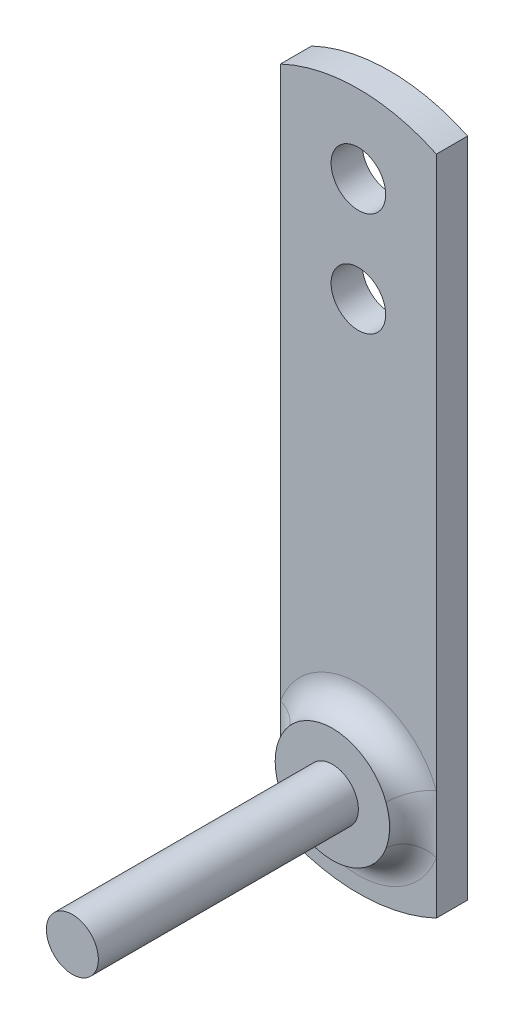
ISO-10303-21;
HEADER;
FILE_DESCRIPTION(('STEP AP214'),'2;1');
FILE_NAME('part.step','',(''),(''),'','','');
FILE_SCHEMA(('AUTOMOTIVE_DESIGN { 1 0 10303 214 1 1 1 1 }'));
ENDSEC;
DATA;
#1=APPLICATION_CONTEXT('core data for automotive mechanical design processes');
#2=APPLICATION_PROTOCOL_DEFINITION('international standard','automotive_design',2000,#1);
#3=PRODUCT_CONTEXT('',#1,'mechanical');
#4=PRODUCT('Part','Part','',(#3));
#5=PRODUCT_RELATED_PRODUCT_CATEGORY('part','',(#4));
#6=PRODUCT_DEFINITION_FORMATION('','',#4);
#7=PRODUCT_DEFINITION_CONTEXT('part definition',#1,'design');
#8=PRODUCT_DEFINITION('design','',#6,#7);
#9=PRODUCT_DEFINITION_SHAPE('','',#8);
#10=(LENGTH_UNIT() NAMED_UNIT(*) SI_UNIT(.MILLI.,.METRE.));
#11=(NAMED_UNIT(*) PLANE_ANGLE_UNIT() SI_UNIT($,.RADIAN.));
#12=(NAMED_UNIT(*) SI_UNIT($,.STERADIAN.) SOLID_ANGLE_UNIT());
#13=UNCERTAINTY_MEASURE_WITH_UNIT(LENGTH_MEASURE(1.E-05),#10,'distance_accuracy_value','');
#14=(GEOMETRIC_REPRESENTATION_CONTEXT(3) GLOBAL_UNCERTAINTY_ASSIGNED_CONTEXT((#13)) GLOBAL_UNIT_ASSIGNED_CONTEXT((#10,
#11,#12)) REPRESENTATION_CONTEXT('',''));
#15=CARTESIAN_POINT('',(0.,0.,0.));
#16=DIRECTION('',(0.,0.,1.));
#17=DIRECTION('',(1.,0.,0.));
#18=AXIS2_PLACEMENT_3D('',#15,#16,#17);
#19=CARTESIAN_POINT('',(0.,0.,6.));
#20=DIRECTION('',(0.,0.,1.));
#21=DIRECTION('',(1.,0.,0.));
#22=AXIS2_PLACEMENT_3D('',#19,#20,#21);
#23=PLANE('',#22);
#24=DIRECTION('',(0.,-1.,0.));
#25=VECTOR('',#24,1.);
#26=CARTESIAN_POINT('',(15.,78.3842876590121,6.));
#27=LINE('',#26,#25);
#28=CARTESIAN_POINT('',(15.,-53.56776436283,6.));
#29=VERTEX_POINT('',#28);
#30=CARTESIAN_POINT('',(15.,-63.6227766016838,6.));
#31=VERTEX_POINT('',#30);
#32=EDGE_CURVE('E120',#29,#31,#27,.T.);
#33=ORIENTED_EDGE('',*,*,#32,.F.);
#34=CARTESIAN_POINT('',(0.,-48.,6.));
#35=DIRECTION('',(0.,0.,1.));
#36=DIRECTION('',(1.,0.,0.));
#37=AXIS2_PLACEMENT_3D('',#34,#35,#36);
#38=CIRCLE('',#37,16.);
#39=CARTESIAN_POINT('',(-15.,-53.56776436283,6.));
#40=VERTEX_POINT('',#39);
#41=EDGE_CURVE('E11',#29,#40,#38,.F.);
#42=ORIENTED_EDGE('',*,*,#41,.T.);
#43=DIRECTION('',(0.,1.,0.));
#44=VECTOR('',#43,1.);
#45=CARTESIAN_POINT('',(-15.,81.3342899513019,6.));
#46=LINE('',#45,#44);
#47=CARTESIAN_POINT('',(-15.,-63.6227766016838,6.));
#48=VERTEX_POINT('',#47);
#49=EDGE_CURVE('E107',#48,#40,#46,.T.);
#50=ORIENTED_EDGE('',*,*,#49,.F.);
#51=CARTESIAN_POINT('',(0.,-32.,6.));
#52=DIRECTION('',(0.,0.,1.));
#53=DIRECTION('',(1.,0.,0.));
#54=AXIS2_PLACEMENT_3D('',#51,#52,#53);
#55=CIRCLE('',#54,35.);
#56=EDGE_CURVE('E119',#48,#31,#55,.T.);
#57=ORIENTED_EDGE('',*,*,#56,.T.);
#58=EDGE_LOOP('',(#33,#42,#50,#57));
#59=FACE_BOUND('',#58,.T.);
#60=ADVANCED_FACE('F36',(#59),#23,.T.);
#61=CARTESIAN_POINT('',(0.,-48.,11.));
#62=DIRECTION('',(0.,0.,-1.));
#63=DIRECTION('',(-1.,0.,0.));
#64=AXIS2_PLACEMENT_3D('',#61,#62,#63);
#65=CYLINDRICAL_SURFACE('',#64,11.);
#66=CARTESIAN_POINT('',(0.,-48.,11.));
#67=DIRECTION('',(0.,0.,1.));
#68=DIRECTION('',(1.,0.,0.));
#69=AXIS2_PLACEMENT_3D('',#66,#67,#68);
#70=CIRCLE('',#69,11.);
#71=CARTESIAN_POINT('',(10.3125,-51.8278379994456,11.));
#72=VERTEX_POINT('',#71);
#73=CARTESIAN_POINT('',(10.3125,-44.1721620005544,11.));
#74=VERTEX_POINT('',#73);
#75=EDGE_CURVE('E260',#72,#74,#70,.T.);
#76=ORIENTED_EDGE('',*,*,#75,.F.);
#77=CARTESIAN_POINT('',(9.84901953096999,-52.8986543334443,10.9543432642947));
#78=CARTESIAN_POINT('',(10.0010746720062,-52.5929389365392,5.31978016582307));
#79=CARTESIAN_POINT('',(15.,-55.1253153941007,6.));
#80=CARTESIAN_POINT('',(9.91249006637963,-52.7710523785193,10.9668841216432));
#81=CARTESIAN_POINT('',(10.0328380042991,-52.5193633756008,5.41820171491973));
#82=CARTESIAN_POINT('',(15.,-54.9397125505695,6.));
#83=CARTESIAN_POINT('',(9.97352042127879,-52.6421193416429,10.9763572454077));
#84=CARTESIAN_POINT('',(10.0683354743481,-52.4371039573594,5.51146275939827));
#85=CARTESIAN_POINT('',(15.,-54.7521735878419,6.));
#86=CARTESIAN_POINT('',(10.090553120884,-52.3819015419835,10.990303104895));
#87=CARTESIAN_POINT('',(10.1434354667891,-52.2586192673774,5.68587930172485));
#88=CARTESIAN_POINT('',(15.,-54.3736749701607,6.));
#89=CARTESIAN_POINT('',(10.146556736485,-52.2506173837531,10.9947771078237));
#90=CARTESIAN_POINT('',(10.1830154080239,-52.1625162480601,5.76733491147689));
#91=CARTESIAN_POINT('',(15.,-54.1827161945564,6.));
#92=CARTESIAN_POINT('',(10.2533777293543,-51.9860490409811,10.9998629685672));
#93=CARTESIAN_POINT('',(10.2636506029862,-51.9584411802903,5.91865930251241));
#94=CARTESIAN_POINT('',(15.,-53.7978895141601,6.));
#95=CARTESIAN_POINT('',(10.3041992343467,-51.8527665468042,11.0004779242599));
#96=CARTESIAN_POINT('',(10.3047328993372,-51.8505248846658,5.98879798570316));
#97=CARTESIAN_POINT('',(15.,-53.6040240680804,6.));
#98=CARTESIAN_POINT('',(10.4006196902524,-51.5843345887404,10.998848089555));
#99=CARTESIAN_POINT('',(10.3864263704099,-51.6245947462518,6.11842943060136));
#100=CARTESIAN_POINT('',(15.,-53.2135775836207,6.));
#101=CARTESIAN_POINT('',(10.4462182866388,-51.4491849988134,10.9966031051521));
#102=CARTESIAN_POINT('',(10.4270966797033,-51.5065641470942,6.17814347200763));
#103=CARTESIAN_POINT('',(15.,-53.0169963619097,6.));
#104=CARTESIAN_POINT('',(10.574928729058,-51.0416964682401,10.9869807320195));
#105=CARTESIAN_POINT('',(10.5451493302411,-51.1421705491452,6.3414964898873));
#106=CARTESIAN_POINT('',(15.,-52.4242857719871,6.));
#107=CARTESIAN_POINT('',(10.6501435294883,-50.7668511457815,10.9767182113047));
#108=CARTESIAN_POINT('',(10.6205339628191,-50.8805437084203,6.43255821485963));
#109=CARTESIAN_POINT('',(15.,-52.024510757503,6.));
#110=CARTESIAN_POINT('',(10.7790276846072,-50.2121669395602,10.9546358557937));
#111=CARTESIAN_POINT('',(10.7537200392185,-50.3346003485019,6.58196835229159));
#112=CARTESIAN_POINT('',(15.,-51.2176973666351,6.));
#113=CARTESIAN_POINT('',(10.8326924477218,-49.9323270048686,10.9428156898286));
#114=CARTESIAN_POINT('',(10.8121761332344,-50.0491677955452,6.64126599080082));
#115=CARTESIAN_POINT('',(15.,-50.8106574616276,6.));
#116=CARTESIAN_POINT('',(10.9197048266171,-49.359073470479,10.9218129241271));
#117=CARTESIAN_POINT('',(10.908094102695,-49.4543347553493,6.73450030022449));
#118=CARTESIAN_POINT('',(15.,-49.9768341388779,6.));
#119=CARTESIAN_POINT('',(10.9522479027747,-49.0655348686225,10.9127411112483));
#120=CARTESIAN_POINT('',(10.9452996638912,-49.1426980463662,6.76806488509289));
#121=CARTESIAN_POINT('',(15.,-49.5498688998143,6.));
#122=CARTESIAN_POINT('',(10.9936250915388,-48.4767551552434,10.9009596350592));
#123=CARTESIAN_POINT('',(10.9925235679015,-48.5140197113948,6.81016452231171));
#124=CARTESIAN_POINT('',(15.,-48.6934620439906,6.));
#125=CARTESIAN_POINT('',(11.0024612841987,-48.1815141953648,10.8982494135825));
#126=CARTESIAN_POINT('',(11.0028326460893,-48.1950942044044,6.8189630476714));
#127=CARTESIAN_POINT('',(15.,-48.2640206478034,6.));
#128=CARTESIAN_POINT('',(10.9963652618408,-47.5912621311003,10.9000578103853));
#129=CARTESIAN_POINT('',(10.9958134779491,-47.5602319868525,6.81285164481071));
#130=CARTESIAN_POINT('',(15.,-47.4054721906912,6.));
#131=CARTESIAN_POINT('',(10.9814309411238,-47.2962510493943,10.904577069085));
#132=CARTESIAN_POINT('',(10.9784394704674,-47.2423482786277,6.79790218416952));
#133=CARTESIAN_POINT('',(15.,-46.9763651627553,6.));
#134=CARTESIAN_POINT('',(10.9278966923711,-46.7084137278314,10.9193811000693));
#135=CARTESIAN_POINT('',(10.9177214708717,-46.6178887971359,6.74288444164734));
#136=CARTESIAN_POINT('',(15.,-46.1213290586638,6.));
#137=CARTESIAN_POINT('',(10.8892930022328,-46.4155878427887,10.9296667888708));
#138=CARTESIAN_POINT('',(10.8740052585625,-46.3094732288183,6.70246755005207));
#139=CARTESIAN_POINT('',(15.,-45.6954004986018,6.));
#140=CARTESIAN_POINT('',(10.7869599167274,-45.8240713696608,10.9527354527056));
#141=CARTESIAN_POINT('',(10.7626797544808,-45.70233014013,6.59071877455639));
#142=CARTESIAN_POINT('',(15.,-44.8350129013247,6.));
#143=CARTESIAN_POINT('',(10.7224150780402,-45.5255235274626,10.9655919077881));
#144=CARTESIAN_POINT('',(10.693644271883,-45.4027425362874,6.51761277067156));
#145=CARTESIAN_POINT('',(15.,-44.400761494491,6.));
#146=CARTESIAN_POINT('',(10.5687090746338,-44.9347984717748,10.9873582957196));
#147=CARTESIAN_POINT('',(10.5397430742102,-44.8359263910924,6.33377850625619));
#148=CARTESIAN_POINT('',(15.,-43.5415250498457,6.));
#149=CARTESIAN_POINT('',(10.4795555704407,-44.6426193062453,10.9962694544707));
#150=CARTESIAN_POINT('',(10.4540544867434,-44.5675289864364,6.22168304860341));
#151=CARTESIAN_POINT('',(15.,-43.1165371727033,6.));
#152=CARTESIAN_POINT('',(10.3277381057932,-44.2103771524916,11.0004892661775));
#153=CARTESIAN_POINT('',(10.3240978889521,-44.201285598489,6.02089034709012));
#154=CARTESIAN_POINT('',(15.,-42.4878213127236,6.));
#155=CARTESIAN_POINT('',(10.2740429298954,-44.067133767253,11.0003657586659));
#156=CARTESIAN_POINT('',(10.2799277941294,-44.0838399180837,5.94733777912535));
#157=CARTESIAN_POINT('',(15.,-42.2794672978461,6.));
#158=CARTESIAN_POINT('',(10.1607400750403,-43.7830414774028,10.9958059377073));
#159=CARTESIAN_POINT('',(10.1931502422017,-43.8623252932863,5.78774773935663));
#160=CARTESIAN_POINT('',(15.,-41.866242148926,6.));
#161=CARTESIAN_POINT('',(10.1011330767752,-43.6421922993027,10.9913701202667));
#162=CARTESIAN_POINT('',(10.1505024735129,-43.7583008244862,5.7013950182978));
#163=CARTESIAN_POINT('',(15.,-41.661370617082,6.));
#164=CARTESIAN_POINT('',(9.97606010511942,-43.3630139874785,10.9768340365437));
#165=CARTESIAN_POINT('',(10.0696277738488,-43.5658500379253,5.51528524208007));
#166=CARTESIAN_POINT('',(15.,-41.2552930726016,6.));
#167=CARTESIAN_POINT('',(9.91058611675994,-43.2246886216739,10.9667259189875));
#168=CARTESIAN_POINT('',(10.0314300467908,-43.4775905615575,5.41514342151444));
#169=CARTESIAN_POINT('',(15.,-41.0540925405755,6.));
#170=CARTESIAN_POINT('',(9.77404982189177,-42.9511010788706,10.939288258308));
#171=CARTESIAN_POINT('',(9.96334107720687,-43.3194030037167,5.20138498564989));
#172=CARTESIAN_POINT('',(15.,-40.656147023849,6.));
#173=CARTESIAN_POINT('',(9.70298510285237,-42.8158402570817,10.9219555835988));
#174=CARTESIAN_POINT('',(9.93357290694165,-43.249741404499,5.08735909442272));
#175=CARTESIAN_POINT('',(15.,-40.4594040103625,6.));
#176=CARTESIAN_POINT('',(9.62925356458197,-42.6823430169871,10.9002383336987));
#177=CARTESIAN_POINT('',(9.91042863282082,-43.1914969614329,4.96778853817506));
#178=CARTESIAN_POINT('',(15.,-40.2652262065267,6.));
#179=(BOUNDED_SURFACE() B_SPLINE_SURFACE(3,2,((#77,#78,#79),(#80,#81,#82),(#83,#84,#85),(#86,
#87,#88),(#89,#90,#91),(#92,#93,#94),(#95,#96,#97),(#98,#99,#100),(#101,#102,#103),(#104,#105,
#106),(#107,#108,#109),(#110,#111,#112),(#113,#114,#115),(#116,#117,#118),(#119,#120,#121),
(#122,#123,#124),(#125,#126,#127),(#128,#129,#130),(#131,#132,#133),(#134,#135,#136),(#137,#138,
#139),(#140,#141,#142),(#143,#144,#145),(#146,#147,#148),(#149,#150,#151),(#152,#153,#154),
(#155,#156,#157),(#158,#159,#160),(#161,#162,#163),(#164,#165,#166),(#167,#168,#169),(#170,#171,
#172),(#173,#174,#175),(#176,#177,#178)),.UNSPECIFIED.,.F.,.F.,
.F.) B_SPLINE_SURFACE_WITH_KNOTS((4,2,2,2,2,2,2,2,2,2,2,2,2,2,2,2,4),(3,3),(0.,
0.622914845060951,1.24567175423746,1.86792867681649,2.49022781270345,3.73263677351024,
4.97531030878153,6.26290363831754,7.55038399009717,8.83797839903638,10.125777516366,
11.4576936324618,12.7891955979614,13.4565390794951,14.123805811554,14.7919984223422,
15.4604809723174),(0.,1.),
.UNSPECIFIED.) GEOMETRIC_REPRESENTATION_ITEM() RATIONAL_B_SPLINE_SURFACE(((1.,0.663052513366516,
1.),(1.,0.668993186421282,1.),(1.,0.674744873948884,1.),(1.,0.685836092418846,1.),(1.,
0.691175727491003,1.),(1.,0.701407592139213,1.),(1.,0.706300177477387,1.),(1.,0.715618611712777,
1.),(1.,0.720044428924526,1.),(1.,0.73257668750907,1.),(1.,0.739956073187015,1.),(1.,
0.752649270654803,1.),(1.,0.757962642240258,1.),(1.,0.766595953392395,1.),(1.,0.769836892218614,
1.),(1.,0.773959912683765,1.),(1.,0.774842201271784,1.),(1.,0.774234076467788,1.),(1.,
0.772743452872515,1.),(1.,0.767413263035819,1.),(1.,0.763573323385074,1.),(1.,0.753436450099121,
1.),(1.,0.747059852079028,1.),(1.,0.731972809376815,1.),(1.,0.723263091005561,1.),(1.,
0.708569885303874,1.),(1.,0.703393568153058,1.),(1.,0.692529454104113,1.),(1.,0.686841716098433,
1.),(1.,0.674982906668291,1.),(1.,0.668811175536166,1.),(1.,0.656039794778226,1.),(1.,
0.64943996063394,1.),(1.,0.642653042659754,1.))) REPRESENTATION_ITEM('') SURFACE());
#180=CARTESIAN_POINT('',(9.84901953096999,-52.8986543334443,10.9543432642947));
#181=CARTESIAN_POINT('',(9.91249006637963,-52.7710523785193,10.9668841216432));
#182=CARTESIAN_POINT('',(9.97352042127879,-52.642119341643,10.9763572454077));
#183=CARTESIAN_POINT('',(10.090553120884,-52.3819015419835,10.990303104895));
#184=CARTESIAN_POINT('',(10.146556736485,-52.2506173837531,10.9947771078237));
#185=CARTESIAN_POINT('',(10.2533777293543,-51.9860490409811,10.9998629685672));
#186=CARTESIAN_POINT('',(10.3041992343467,-51.8527665468042,11.0004779242599));
#187=CARTESIAN_POINT('',(10.4006196902524,-51.5843345887404,10.998848089555));
#188=CARTESIAN_POINT('',(10.4462182866388,-51.4491849988134,10.9966031051521));
#189=CARTESIAN_POINT('',(10.574928729058,-51.0416964682401,10.9869807320195));
#190=CARTESIAN_POINT('',(10.6501435294883,-50.7668511457815,10.9767182113047));
#191=CARTESIAN_POINT('',(10.7790276846072,-50.2121669395602,10.9546358557937));
#192=CARTESIAN_POINT('',(10.8326924477218,-49.9323270048686,10.9428156898286));
#193=CARTESIAN_POINT('',(10.9197048266171,-49.359073470479,10.9218129241271));
#194=CARTESIAN_POINT('',(10.9522479027747,-49.0655348686225,10.9127411112483));
#195=CARTESIAN_POINT('',(10.9936250915388,-48.4767551552434,10.9009596350592));
#196=CARTESIAN_POINT('',(11.0024612841987,-48.1815141953648,10.8982494135825));
#197=CARTESIAN_POINT('',(10.9963652618408,-47.5912621311003,10.9000578103853));
#198=CARTESIAN_POINT('',(10.9814309411238,-47.2962510493943,10.904577069085));
#199=CARTESIAN_POINT('',(10.9278966923711,-46.7084137278314,10.9193811000693));
#200=CARTESIAN_POINT('',(10.8892930022328,-46.4155878427887,10.9296667888708));
#201=CARTESIAN_POINT('',(10.7869599167274,-45.8240713696608,10.9527354527056));
#202=CARTESIAN_POINT('',(10.7224150780402,-45.5255235274626,10.9655919077881));
#203=CARTESIAN_POINT('',(10.5687090746338,-44.9347984717748,10.9873582957196));
#204=CARTESIAN_POINT('',(10.4795555704407,-44.6426193062453,10.9962694544707));
#205=CARTESIAN_POINT('',(10.3277381057932,-44.2103771524916,11.0004892661775));
#206=CARTESIAN_POINT('',(10.2740429298954,-44.067133767253,11.0003657586659));
#207=CARTESIAN_POINT('',(10.1607400750403,-43.7830414774028,10.9958059377073));
#208=CARTESIAN_POINT('',(10.1011330767752,-43.6421922993027,10.9913701202667));
#209=CARTESIAN_POINT('',(9.97606010511942,-43.3630139874785,10.9768340365437));
#210=CARTESIAN_POINT('',(9.91058611675994,-43.2246886216739,10.9667259189875));
#211=CARTESIAN_POINT('',(9.77404982189177,-42.9511010788706,10.939288258308));
#212=CARTESIAN_POINT('',(9.70298510285237,-42.8158402570817,10.9219555835988));
#213=CARTESIAN_POINT('',(9.62925356458197,-42.6823430169871,10.9002383336987));
#214=B_SPLINE_CURVE_WITH_KNOTS('',3,(#180,#181,#182,#183,#184,#185,#186,#187,#188,#189,#190,
#191,#192,#193,#194,#195,#196,#197,#198,#199,#200,#201,#202,#203,#204,#205,#206,#207,#208,#209,
#210,#211,#212,#213),.UNSPECIFIED.,.F.,.F.,(4,2,2,2,2,2,2,2,2,2,2,2,2,2,2,2,4),(0.,
0.622914845060951,1.24567175423746,1.86792867681649,2.49022781270345,3.73263677351024,
4.97531030878153,6.26290363831754,7.55038399009717,8.83797839903638,10.125777516366,
11.4576936324618,12.7891955979614,13.4565390794951,14.123805811554,14.7919984223422,
15.4604809723174),.UNSPECIFIED.);
#215=EDGE_CURVE('E158',#72,#74,#214,.T.);
#216=ORIENTED_EDGE('',*,*,#215,.T.);
#217=EDGE_LOOP('',(#76,#216));
#218=FACE_BOUND('',#217,.T.);
#219=ADVANCED_FACE('F225',(#218),#65,.T.);
#220=CARTESIAN_POINT('',(0.,-32.,6.));
#221=DIRECTION('',(0.,0.,-1.));
#222=DIRECTION('',(-1.,0.,0.));
#223=AXIS2_PLACEMENT_3D('',#220,#221,#222);
#224=CYLINDRICAL_SURFACE('',#223,35.);
#225=CARTESIAN_POINT('',(0.,-32.,0.));
#226=DIRECTION('',(0.,0.,1.));
#227=DIRECTION('',(1.,0.,0.));
#228=AXIS2_PLACEMENT_3D('',#225,#226,#227);
#229=CIRCLE('',#228,35.);
#230=CARTESIAN_POINT('',(-15.,-63.6227766016838,0.));
#231=VERTEX_POINT('',#230);
#232=CARTESIAN_POINT('',(15.,-63.6227766016838,0.));
#233=VERTEX_POINT('',#232);
#234=EDGE_CURVE('E142',#231,#233,#229,.T.);
#235=ORIENTED_EDGE('',*,*,#234,.T.);
#236=DIRECTION('',(0.,0.,-1.));
#237=VECTOR('',#236,1.);
#238=CARTESIAN_POINT('',(15.,-63.6227766016838,6.));
#239=LINE('',#238,#237);
#240=EDGE_CURVE('E125',#233,#31,#239,.F.);
#241=ORIENTED_EDGE('',*,*,#240,.T.);
#242=ORIENTED_EDGE('',*,*,#56,.F.);
#243=DIRECTION('',(0.,0.,-1.));
#244=VECTOR('',#243,1.);
#245=CARTESIAN_POINT('',(-15.,-63.6227766016838,6.));
#246=LINE('',#245,#244);
#247=EDGE_CURVE('E105',#48,#231,#246,.T.);
#248=ORIENTED_EDGE('',*,*,#247,.T.);
#249=EDGE_LOOP('',(#235,#241,#242,#248));
#250=FACE_BOUND('',#249,.T.);
#251=ADVANCED_FACE('F124',(#250),#224,.T.);
#252=CARTESIAN_POINT('',(0.,32.,6.));
#253=DIRECTION('',(0.,0.,-1.));
#254=DIRECTION('',(-1.,0.,0.));
#255=AXIS2_PLACEMENT_3D('',#252,#253,#254);
#256=CYLINDRICAL_SURFACE('',#255,5.25);
#257=CARTESIAN_POINT('',(0.,32.,6.));
#258=DIRECTION('',(0.,0.,1.));
#259=DIRECTION('',(1.,0.,0.));
#260=AXIS2_PLACEMENT_3D('',#257,#258,#259);
#261=CIRCLE('',#260,5.25);
#262=CARTESIAN_POINT('',(5.25000000000001,32.,6.));
#263=VERTEX_POINT('',#262);
#264=EDGE_CURVE('E127',#263,#263,#261,.T.);
#265=ORIENTED_EDGE('',*,*,#264,.T.);
#266=EDGE_LOOP('',(#265));
#267=FACE_BOUND('',#266,.T.);
#268=CARTESIAN_POINT('',(0.,32.,0.));
#269=DIRECTION('',(0.,0.,1.));
#270=DIRECTION('',(1.,0.,0.));
#271=AXIS2_PLACEMENT_3D('',#268,#269,#270);
#272=CIRCLE('',#271,5.25);
#273=CARTESIAN_POINT('',(5.25000000000001,32.,0.));
#274=VERTEX_POINT('',#273);
#275=EDGE_CURVE('E138',#274,#274,#272,.T.);
#276=ORIENTED_EDGE('',*,*,#275,.F.);
#277=EDGE_LOOP('',(#276));
#278=FACE_BOUND('',#277,.T.);
#279=ADVANCED_FACE('F246',(#267,#278),#256,.F.);
#280=CARTESIAN_POINT('',(0.,52.,6.));
#281=DIRECTION('',(0.,0.,-1.));
#282=DIRECTION('',(-1.,0.,0.));
#283=AXIS2_PLACEMENT_3D('',#280,#281,#282);
#284=CYLINDRICAL_SURFACE('',#283,5.25);
#285=CARTESIAN_POINT('',(0.,52.,6.));
#286=DIRECTION('',(0.,0.,1.));
#287=DIRECTION('',(1.,0.,0.));
#288=AXIS2_PLACEMENT_3D('',#285,#286,#287);
#289=CIRCLE('',#288,5.25);
#290=CARTESIAN_POINT('',(5.25000000000001,52.,6.));
#291=VERTEX_POINT('',#290);
#292=EDGE_CURVE('E131',#291,#291,#289,.T.);
#293=ORIENTED_EDGE('',*,*,#292,.T.);
#294=EDGE_LOOP('',(#293));
#295=FACE_BOUND('',#294,.T.);
#296=CARTESIAN_POINT('',(0.,52.,0.));
#297=DIRECTION('',(0.,0.,1.));
#298=DIRECTION('',(1.,0.,0.));
#299=AXIS2_PLACEMENT_3D('',#296,#297,#298);
#300=CIRCLE('',#299,5.25);
#301=CARTESIAN_POINT('',(5.25000000000001,52.,0.));
#302=VERTEX_POINT('',#301);
#303=EDGE_CURVE('E135',#302,#302,#300,.T.);
#304=ORIENTED_EDGE('',*,*,#303,.F.);
#305=EDGE_LOOP('',(#304));
#306=FACE_BOUND('',#305,.T.);
#307=ADVANCED_FACE('F171',(#295,#306),#284,.F.);
#308=CARTESIAN_POINT('',(0.,32.,6.));
#309=DIRECTION('',(0.,0.,-1.));
#310=DIRECTION('',(-1.,0.,0.));
#311=AXIS2_PLACEMENT_3D('',#308,#309,#310);
#312=CYLINDRICAL_SURFACE('',#311,35.);
#313=CARTESIAN_POINT('',(0.,32.,6.));
#314=DIRECTION('',(0.,0.,1.));
#315=DIRECTION('',(1.,0.,0.));
#316=AXIS2_PLACEMENT_3D('',#313,#314,#315);
#317=CIRCLE('',#316,35.);
#318=CARTESIAN_POINT('',(15.,63.6227766016838,6.));
#319=VERTEX_POINT('',#318);
#320=CARTESIAN_POINT('',(-15.,63.6227766016838,6.));
#321=VERTEX_POINT('',#320);
#322=EDGE_CURVE('E126',#319,#321,#317,.T.);
#323=ORIENTED_EDGE('',*,*,#322,.F.);
#324=DIRECTION('',(0.,0.,-1.));
#325=VECTOR('',#324,1.);
#326=CARTESIAN_POINT('',(15.,63.6227766016838,6.));
#327=LINE('',#326,#325);
#328=CARTESIAN_POINT('',(15.,63.6227766016838,0.));
#329=VERTEX_POINT('',#328);
#330=EDGE_CURVE('E115',#319,#329,#327,.T.);
#331=ORIENTED_EDGE('',*,*,#330,.T.);
#332=CARTESIAN_POINT('',(0.,32.,0.));
#333=DIRECTION('',(0.,0.,1.));
#334=DIRECTION('',(1.,0.,0.));
#335=AXIS2_PLACEMENT_3D('',#332,#333,#334);
#336=CIRCLE('',#335,35.);
#337=CARTESIAN_POINT('',(-15.,63.6227766016838,0.));
#338=VERTEX_POINT('',#337);
#339=EDGE_CURVE('E144',#329,#338,#336,.T.);
#340=ORIENTED_EDGE('',*,*,#339,.T.);
#341=DIRECTION('',(0.,0.,-1.));
#342=VECTOR('',#341,1.);
#343=CARTESIAN_POINT('',(-15.,63.6227766016838,6.));
#344=LINE('',#343,#342);
#345=EDGE_CURVE('E116',#338,#321,#344,.F.);
#346=ORIENTED_EDGE('',*,*,#345,.T.);
#347=EDGE_LOOP('',(#323,#331,#340,#346));
#348=FACE_BOUND('',#347,.T.);
#349=ADVANCED_FACE('F232',(#348),#312,.T.);
#350=CARTESIAN_POINT('',(-15.,-42.43223563717,6.));
#351=VERTEX_POINT('',#350);
#352=EDGE_CURVE('E56',#351,#321,#46,.T.);
#353=ORIENTED_EDGE('',*,*,#352,.F.);
#354=CARTESIAN_POINT('',(0.,-48.,6.));
#355=DIRECTION('',(0.,0.,1.));
#356=DIRECTION('',(1.,0.,0.));
#357=AXIS2_PLACEMENT_3D('',#354,#355,#356);
#358=CIRCLE('',#357,16.);
#359=CARTESIAN_POINT('',(15.,-42.43223563717,6.));
#360=VERTEX_POINT('',#359);
#361=EDGE_CURVE('E48',#351,#360,#358,.F.);
#362=ORIENTED_EDGE('',*,*,#361,.T.);
#363=EDGE_CURVE('E395',#319,#360,#27,.T.);
#364=ORIENTED_EDGE('',*,*,#363,.F.);
#365=ORIENTED_EDGE('',*,*,#322,.T.);
#366=EDGE_LOOP('',(#353,#362,#364,#365));
#367=FACE_BOUND('',#366,.T.);
#368=ORIENTED_EDGE('',*,*,#292,.F.);
#369=EDGE_LOOP('',(#368));
#370=FACE_BOUND('',#369,.T.);
#371=ORIENTED_EDGE('',*,*,#264,.F.);
#372=EDGE_LOOP('',(#371));
#373=FACE_BOUND('',#372,.T.);
#374=ADVANCED_FACE('F187',(#367,#370,#373),#23,.T.);
#375=CARTESIAN_POINT('',(0.,0.,0.));
#376=DIRECTION('',(0.,0.,1.));
#377=DIRECTION('',(1.,0.,0.));
#378=AXIS2_PLACEMENT_3D('',#375,#376,#377);
#379=PLANE('',#378);
#380=ORIENTED_EDGE('',*,*,#303,.T.);
#381=EDGE_LOOP('',(#380));
#382=FACE_BOUND('',#381,.T.);
#383=ORIENTED_EDGE('',*,*,#275,.T.);
#384=EDGE_LOOP('',(#383));
#385=FACE_BOUND('',#384,.T.);
#386=ORIENTED_EDGE('',*,*,#339,.F.);
#387=DIRECTION('',(0.,-1.,0.));
#388=VECTOR('',#387,1.);
#389=CARTESIAN_POINT('',(15.,0.,0.));
#390=LINE('',#389,#388);
#391=EDGE_CURVE('E148',#329,#233,#390,.T.);
#392=ORIENTED_EDGE('',*,*,#391,.T.);
#393=ORIENTED_EDGE('',*,*,#234,.F.);
#394=DIRECTION('',(0.,1.,0.));
#395=VECTOR('',#394,1.);
#396=CARTESIAN_POINT('',(-15.,0.,0.));
#397=LINE('',#396,#395);
#398=EDGE_CURVE('E110',#231,#338,#397,.T.);
#399=ORIENTED_EDGE('',*,*,#398,.T.);
#400=EDGE_LOOP('',(#386,#392,#393,#399));
#401=FACE_BOUND('',#400,.T.);
#402=ADVANCED_FACE('F231',(#382,#385,#401),#379,.F.);
#403=CARTESIAN_POINT('',(-10.3125,-44.1721620005544,11.));
#404=VERTEX_POINT('',#403);
#405=CARTESIAN_POINT('',(-10.3125,-51.8278379994457,11.));
#406=VERTEX_POINT('',#405);
#407=EDGE_CURVE('E265',#404,#406,#70,.T.);
#408=ORIENTED_EDGE('',*,*,#407,.F.);
#409=CARTESIAN_POINT('',(-9.84901953096995,-43.1013456665558,10.9543432642947));
#410=CARTESIAN_POINT('',(-10.0010746720061,-43.4070610634609,5.31978016582307));
#411=CARTESIAN_POINT('',(-15.,-40.8746846058993,6.));
#412=CARTESIAN_POINT('',(-9.9124900663796,-43.2289476214807,10.9668841216432));
#413=CARTESIAN_POINT('',(-10.0328380042991,-43.4806366243993,5.41820171491973));
#414=CARTESIAN_POINT('',(-15.,-41.0602874494305,6.));
#415=CARTESIAN_POINT('',(-9.97352042127876,-43.3578806583571,10.9763572454077));
#416=CARTESIAN_POINT('',(-10.068335474348,-43.5628960426406,5.51146275939827));
#417=CARTESIAN_POINT('',(-15.,-41.2478264121581,6.));
#418=CARTESIAN_POINT('',(-10.0905531208839,-43.6180984580165,10.990303104895));
#419=CARTESIAN_POINT('',(-10.143435466789,-43.7413807326226,5.68587930172486));
#420=CARTESIAN_POINT('',(-15.,-41.6263250298393,6.));
#421=CARTESIAN_POINT('',(-10.146556736485,-43.7493826162469,10.9947771078237));
#422=CARTESIAN_POINT('',(-10.1830154080239,-43.8374837519399,5.76733491147689));
#423=CARTESIAN_POINT('',(-15.,-41.8172838054436,6.));
#424=CARTESIAN_POINT('',(-10.2533777293542,-44.0139509590189,10.9998629685672));
#425=CARTESIAN_POINT('',(-10.2636506029862,-44.0415588197097,5.91865930251242));
#426=CARTESIAN_POINT('',(-15.,-42.20211048584,6.));
#427=CARTESIAN_POINT('',(-10.3041992343466,-44.1472334531958,11.0004779242599));
#428=CARTESIAN_POINT('',(-10.3047328993372,-44.1494751153342,5.98879798570317));
#429=CARTESIAN_POINT('',(-15.,-42.3959759319196,6.));
#430=CARTESIAN_POINT('',(-10.4006196902524,-44.4156654112597,10.998848089555));
#431=CARTESIAN_POINT('',(-10.3864263704099,-44.3754052537483,6.11842943060137));
#432=CARTESIAN_POINT('',(-15.,-42.7864224163793,6.));
#433=CARTESIAN_POINT('',(-10.4462182866388,-44.5508150011866,10.9966031051521));
#434=CARTESIAN_POINT('',(-10.4270966797032,-44.4934358529059,6.17814347200764));
#435=CARTESIAN_POINT('',(-15.,-42.9830036380904,6.));
#436=CARTESIAN_POINT('',(-10.574928729058,-44.9583035317599,10.9869807320195));
#437=CARTESIAN_POINT('',(-10.5451493302411,-44.8578294508548,6.34149648988731));
#438=CARTESIAN_POINT('',(-15.,-43.5757142280129,6.));
#439=CARTESIAN_POINT('',(-10.6501435294883,-45.2331488542185,10.9767182113047));
#440=CARTESIAN_POINT('',(-10.6205339628191,-45.1194562915797,6.43255821485963));
#441=CARTESIAN_POINT('',(-15.,-43.9754892424971,6.));
#442=CARTESIAN_POINT('',(-10.7790276846071,-45.7878330604398,10.9546358557937));
#443=CARTESIAN_POINT('',(-10.7537200392185,-45.6653996514981,6.58196835229159));
#444=CARTESIAN_POINT('',(-15.,-44.7823026333649,6.));
#445=CARTESIAN_POINT('',(-10.8326924477217,-46.0676729951314,10.9428156898286));
#446=CARTESIAN_POINT('',(-10.8121761332344,-45.9508322044549,6.64126599080083));
#447=CARTESIAN_POINT('',(-15.,-45.1893425383724,6.));
#448=CARTESIAN_POINT('',(-10.9197048266171,-46.640926529521,10.9218129241271));
#449=CARTESIAN_POINT('',(-10.9080941026949,-46.5456652446508,6.73450030022449));
#450=CARTESIAN_POINT('',(-15.,-46.0231658611221,6.));
#451=CARTESIAN_POINT('',(-10.9522479027747,-46.9344651313776,10.9127411112483));
#452=CARTESIAN_POINT('',(-10.9452996638912,-46.8573019536338,6.7680648850929));
#453=CARTESIAN_POINT('',(-15.,-46.4501311001857,6.));
#454=CARTESIAN_POINT('',(-10.9936250915388,-47.5232448447566,10.9009596350592));
#455=CARTESIAN_POINT('',(-10.9925235679014,-47.4859802886053,6.81016452231171));
#456=CARTESIAN_POINT('',(-15.,-47.3065379560094,6.));
#457=CARTESIAN_POINT('',(-11.0024612841987,-47.8184858046352,10.8982494135825));
#458=CARTESIAN_POINT('',(-11.0028326460893,-47.8049057955956,6.81896304767141));
#459=CARTESIAN_POINT('',(-15.,-47.7359793521966,6.));
#460=CARTESIAN_POINT('',(-10.9963652618408,-48.4087378688997,10.9000578103853));
#461=CARTESIAN_POINT('',(-10.995813477949,-48.4397680131475,6.81285164481072));
#462=CARTESIAN_POINT('',(-15.,-48.5945278093088,6.));
#463=CARTESIAN_POINT('',(-10.9814309411237,-48.7037489506058,10.904577069085));
#464=CARTESIAN_POINT('',(-10.9784394704674,-48.7576517213723,6.79790218416953));
#465=CARTESIAN_POINT('',(-15.,-49.0236348372448,6.));
#466=CARTESIAN_POINT('',(-10.9278966923711,-49.2915862721686,10.9193811000693));
#467=CARTESIAN_POINT('',(-10.9177214708717,-49.3821112028641,6.74288444164735));
#468=CARTESIAN_POINT('',(-15.,-49.8786709413362,6.));
#469=CARTESIAN_POINT('',(-10.8892930022328,-49.5844121572113,10.9296667888708));
#470=CARTESIAN_POINT('',(-10.8740052585624,-49.6905267711817,6.70246755005208));
#471=CARTESIAN_POINT('',(-15.,-50.3045995013982,6.));
#472=CARTESIAN_POINT('',(-10.7869599167274,-50.1759286303393,10.9527354527056));
#473=CARTESIAN_POINT('',(-10.7626797544808,-50.29766985987,6.5907187745564));
#474=CARTESIAN_POINT('',(-15.,-51.1649870986753,6.));
#475=CARTESIAN_POINT('',(-10.7224150780401,-50.4744764725374,10.9655919077881));
#476=CARTESIAN_POINT('',(-10.693644271883,-50.5972574637127,6.51761277067157));
#477=CARTESIAN_POINT('',(-15.,-51.599238505509,6.));
#478=CARTESIAN_POINT('',(-10.5687090746338,-51.0652015282252,10.9873582957196));
#479=CARTESIAN_POINT('',(-10.5397430742102,-51.1640736089076,6.33377850625621));
#480=CARTESIAN_POINT('',(-15.,-52.4584749501543,6.));
#481=CARTESIAN_POINT('',(-10.4795555704407,-51.3573806937548,10.9962694544707));
#482=CARTESIAN_POINT('',(-10.4540544867434,-51.4324710135636,6.22168304860343));
#483=CARTESIAN_POINT('',(-15.,-52.8834628272967,6.));
#484=CARTESIAN_POINT('',(-10.3277381057932,-51.7896228475084,11.0004892661775));
#485=CARTESIAN_POINT('',(-10.3240978889521,-51.798714401511,6.02089034709014));
#486=CARTESIAN_POINT('',(-15.,-53.5121786872764,6.));
#487=CARTESIAN_POINT('',(-10.2740429298954,-51.932866232747,11.0003657586659));
#488=CARTESIAN_POINT('',(-10.2799277941294,-51.9161600819163,5.94733777912536));
#489=CARTESIAN_POINT('',(-15.,-53.7205327021539,6.));
#490=CARTESIAN_POINT('',(-10.1607400750403,-52.2169585225972,10.9958059377073));
#491=CARTESIAN_POINT('',(-10.1931502422017,-52.1376747067137,5.78774773935664));
#492=CARTESIAN_POINT('',(-15.,-54.133757851074,6.));
#493=CARTESIAN_POINT('',(-10.1011330767752,-52.3578077006973,10.9913701202667));
#494=CARTESIAN_POINT('',(-10.1505024735129,-52.2416991755138,5.70139501829781));
#495=CARTESIAN_POINT('',(-15.,-54.338629382918,6.));
#496=CARTESIAN_POINT('',(-9.9760601051194,-52.6369860125215,10.9768340365437));
#497=CARTESIAN_POINT('',(-10.0696277738488,-52.4341499620747,5.51528524208009));
#498=CARTESIAN_POINT('',(-15.,-54.7447069273984,6.));
#499=CARTESIAN_POINT('',(-9.91058611675992,-52.7753113783262,10.9667259189875));
#500=CARTESIAN_POINT('',(-10.0314300467908,-52.5224094384425,5.41514342151446));
#501=CARTESIAN_POINT('',(-15.,-54.9459074594245,6.));
#502=CARTESIAN_POINT('',(-9.77404982189175,-53.0488989211294,10.939288258308));
#503=CARTESIAN_POINT('',(-9.96334107720684,-52.6805969962833,5.20138498564991));
#504=CARTESIAN_POINT('',(-15.,-55.343852976151,6.));
#505=CARTESIAN_POINT('',(-9.70298510285235,-53.1841597429183,10.9219555835988));
#506=CARTESIAN_POINT('',(-9.93357290694161,-52.750258595501,5.08735909442274));
#507=CARTESIAN_POINT('',(-15.,-55.5405959896375,6.));
#508=CARTESIAN_POINT('',(-9.62925356458195,-53.3176569830129,10.9002383336987));
#509=CARTESIAN_POINT('',(-9.91042863282079,-52.8085030385671,4.96778853817508));
#510=CARTESIAN_POINT('',(-15.,-55.7347737934733,6.));
#511=(BOUNDED_SURFACE() B_SPLINE_SURFACE(3,2,((#409,#410,#411),(#412,#413,#414),(#415,#416,
#417),(#418,#419,#420),(#421,#422,#423),(#424,#425,#426),(#427,#428,#429),(#430,#431,#432),
(#433,#434,#435),(#436,#437,#438),(#439,#440,#441),(#442,#443,#444),(#445,#446,#447),(#448,#449,
#450),(#451,#452,#453),(#454,#455,#456),(#457,#458,#459),(#460,#461,#462),(#463,#464,#465),
(#466,#467,#468),(#469,#470,#471),(#472,#473,#474),(#475,#476,#477),(#478,#479,#480),(#481,#482,
#483),(#484,#485,#486),(#487,#488,#489),(#490,#491,#492),(#493,#494,#495),(#496,#497,#498),
(#499,#500,#501),(#502,#503,#504),(#505,#506,#507),(#508,#509,#510)),.UNSPECIFIED.,.F.,.F.,
.F.) B_SPLINE_SURFACE_WITH_KNOTS((4,2,2,2,2,2,2,2,2,2,2,2,2,2,2,2,4),(3,3),(0.,
0.622914845060951,1.24567175423747,1.8679286768165,2.49022781270346,3.73263677351024,
4.97531030878153,6.26290363831753,7.55038399009717,8.83797839903638,10.125777516366,
11.4576936324618,12.7891955979614,13.4565390794951,14.123805811554,14.7919984223422,
15.4604809723174),(0.,1.),
.UNSPECIFIED.) GEOMETRIC_REPRESENTATION_ITEM() RATIONAL_B_SPLINE_SURFACE(((1.,0.663052513366516,
1.),(1.,0.668993186421282,1.),(1.,0.674744873948884,1.),(1.,0.685836092418846,1.),(1.,
0.691175727491003,1.),(1.,0.701407592139213,1.),(1.,0.706300177477388,1.),(1.,0.715618611712777,
1.),(1.,0.720044428924527,1.),(1.,0.73257668750907,1.),(1.,0.739956073187016,1.),(1.,
0.752649270654803,1.),(1.,0.757962642240259,1.),(1.,0.766595953392396,1.),(1.,0.769836892218615,
1.),(1.,0.773959912683765,1.),(1.,0.774842201271785,1.),(1.,0.774234076467789,1.),(1.,
0.772743452872516,1.),(1.,0.76741326303582,1.),(1.,0.763573323385075,1.),(1.,0.753436450099121,
1.),(1.,0.747059852079029,1.),(1.,0.731972809376817,1.),(1.,0.723263091005563,1.),(1.,
0.708569885303875,1.),(1.,0.703393568153059,1.),(1.,0.692529454104114,1.),(1.,0.686841716098434,
1.),(1.,0.674982906668292,1.),(1.,0.668811175536167,1.),(1.,0.656039794778228,1.),(1.,
0.649439960633942,1.),(1.,0.642653042659755,1.))) REPRESENTATION_ITEM('') SURFACE());
#512=CARTESIAN_POINT('',(-9.84901953096995,-43.1013456665558,10.9543432642947));
#513=CARTESIAN_POINT('',(-9.9124900663796,-43.2289476214807,10.9668841216432));
#514=CARTESIAN_POINT('',(-9.97352042127876,-43.3578806583571,10.9763572454077));
#515=CARTESIAN_POINT('',(-10.0905531208839,-43.6180984580165,10.990303104895));
#516=CARTESIAN_POINT('',(-10.146556736485,-43.7493826162469,10.9947771078237));
#517=CARTESIAN_POINT('',(-10.2533777293542,-44.0139509590189,10.9998629685672));
#518=CARTESIAN_POINT('',(-10.3041992343466,-44.1472334531958,11.0004779242599));
#519=CARTESIAN_POINT('',(-10.4006196902524,-44.4156654112597,10.998848089555));
#520=CARTESIAN_POINT('',(-10.4462182866388,-44.5508150011866,10.9966031051521));
#521=CARTESIAN_POINT('',(-10.574928729058,-44.9583035317599,10.9869807320195));
#522=CARTESIAN_POINT('',(-10.6501435294883,-45.2331488542185,10.9767182113047));
#523=CARTESIAN_POINT('',(-10.7790276846071,-45.7878330604398,10.9546358557937));
#524=CARTESIAN_POINT('',(-10.8326924477217,-46.0676729951314,10.9428156898286));
#525=CARTESIAN_POINT('',(-10.9197048266171,-46.640926529521,10.9218129241271));
#526=CARTESIAN_POINT('',(-10.9522479027747,-46.9344651313776,10.9127411112483));
#527=CARTESIAN_POINT('',(-10.9936250915388,-47.5232448447566,10.9009596350592));
#528=CARTESIAN_POINT('',(-11.0024612841987,-47.8184858046352,10.8982494135825));
#529=CARTESIAN_POINT('',(-10.9963652618408,-48.4087378688997,10.9000578103853));
#530=CARTESIAN_POINT('',(-10.9814309411237,-48.7037489506058,10.904577069085));
#531=CARTESIAN_POINT('',(-10.9278966923711,-49.2915862721686,10.9193811000693));
#532=CARTESIAN_POINT('',(-10.8892930022328,-49.5844121572113,10.9296667888708));
#533=CARTESIAN_POINT('',(-10.7869599167274,-50.1759286303393,10.9527354527056));
#534=CARTESIAN_POINT('',(-10.7224150780401,-50.4744764725374,10.9655919077881));
#535=CARTESIAN_POINT('',(-10.5687090746338,-51.0652015282252,10.9873582957196));
#536=CARTESIAN_POINT('',(-10.4795555704407,-51.3573806937548,10.9962694544707));
#537=CARTESIAN_POINT('',(-10.3277381057932,-51.7896228475084,11.0004892661775));
#538=CARTESIAN_POINT('',(-10.2740429298954,-51.932866232747,11.0003657586659));
#539=CARTESIAN_POINT('',(-10.1607400750403,-52.2169585225972,10.9958059377073));
#540=CARTESIAN_POINT('',(-10.1011330767752,-52.3578077006973,10.9913701202667));
#541=CARTESIAN_POINT('',(-9.9760601051194,-52.6369860125215,10.9768340365437));
#542=CARTESIAN_POINT('',(-9.91058611675992,-52.7753113783262,10.9667259189875));
#543=CARTESIAN_POINT('',(-9.77404982189175,-53.0488989211294,10.939288258308));
#544=CARTESIAN_POINT('',(-9.70298510285235,-53.1841597429184,10.9219555835988));
#545=CARTESIAN_POINT('',(-9.62925356458195,-53.3176569830129,10.9002383336987));
#546=B_SPLINE_CURVE_WITH_KNOTS('',3,(#512,#513,#514,#515,#516,#517,#518,#519,#520,#521,#522,
#523,#524,#525,#526,#527,#528,#529,#530,#531,#532,#533,#534,#535,#536,#537,#538,#539,#540,#541,
#542,#543,#544,#545),.UNSPECIFIED.,.F.,.F.,(4,2,2,2,2,2,2,2,2,2,2,2,2,2,2,2,4),(0.,
0.622914845060951,1.24567175423747,1.8679286768165,2.49022781270346,3.73263677351024,
4.97531030878153,6.26290363831753,7.55038399009717,8.83797839903638,10.125777516366,
11.4576936324618,12.7891955979614,13.4565390794951,14.123805811554,14.7919984223422,
15.4604809723174),.UNSPECIFIED.);
#547=EDGE_CURVE('E151',#404,#406,#546,.T.);
#548=ORIENTED_EDGE('',*,*,#547,.T.);
#549=EDGE_LOOP('',(#408,#548));
#550=FACE_BOUND('',#549,.T.);
#551=ADVANCED_FACE('F164',(#550),#65,.T.);
#552=CARTESIAN_POINT('',(0.,-48.,11.));
#553=DIRECTION('',(0.,0.,1.));
#554=DIRECTION('',(1.,0.,0.));
#555=AXIS2_PLACEMENT_3D('',#552,#553,#554);
#556=PLANE('',#555);
#557=CARTESIAN_POINT('',(0.,-48.,11.));
#558=DIRECTION('',(0.,0.,1.));
#559=DIRECTION('',(1.,0.,0.));
#560=AXIS2_PLACEMENT_3D('',#557,#558,#559);
#561=CIRCLE('',#560,5.);
#562=CARTESIAN_POINT('',(5.00000000000002,-48.,11.));
#563=VERTEX_POINT('',#562);
#564=EDGE_CURVE('E389',#563,#563,#561,.T.);
#565=ORIENTED_EDGE('',*,*,#564,.F.);
#566=EDGE_LOOP('',(#565));
#567=FACE_BOUND('',#566,.T.);
#568=EDGE_CURVE('E139',#74,#404,#70,.T.);
#569=ORIENTED_EDGE('',*,*,#568,.T.);
#570=ORIENTED_EDGE('',*,*,#407,.T.);
#571=EDGE_CURVE('E412',#406,#72,#70,.T.);
#572=ORIENTED_EDGE('',*,*,#571,.T.);
#573=ORIENTED_EDGE('',*,*,#75,.T.);
#574=EDGE_LOOP('',(#569,#570,#572,#573));
#575=FACE_BOUND('',#574,.T.);
#576=ADVANCED_FACE('F313',(#567,#575),#556,.T.);
#577=CARTESIAN_POINT('',(-15.,81.3342899513019,-4.));
#578=DIRECTION('',(1.,0.,0.));
#579=DIRECTION('',(0.,1.,0.));
#580=AXIS2_PLACEMENT_3D('',#577,#578,#579);
#581=PLANE('',#580);
#582=ORIENTED_EDGE('',*,*,#49,.T.);
#583=EDGE_CURVE('E121',#40,#351,#46,.T.);
#584=ORIENTED_EDGE('',*,*,#583,.T.);
#585=ORIENTED_EDGE('',*,*,#352,.T.);
#586=ORIENTED_EDGE('',*,*,#345,.F.);
#587=ORIENTED_EDGE('',*,*,#398,.F.);
#588=ORIENTED_EDGE('',*,*,#247,.F.);
#589=EDGE_LOOP('',(#582,#584,#585,#586,#587,#588));
#590=FACE_BOUND('',#589,.T.);
#591=ADVANCED_FACE('F106',(#590),#581,.F.);
#592=CARTESIAN_POINT('',(15.,78.3842876590121,-4.));
#593=DIRECTION('',(-1.,0.,0.));
#594=DIRECTION('',(0.,-1.,0.));
#595=AXIS2_PLACEMENT_3D('',#592,#593,#594);
#596=PLANE('',#595);
#597=ORIENTED_EDGE('',*,*,#391,.F.);
#598=ORIENTED_EDGE('',*,*,#330,.F.);
#599=ORIENTED_EDGE('',*,*,#363,.T.);
#600=EDGE_CURVE('E396',#360,#29,#27,.T.);
#601=ORIENTED_EDGE('',*,*,#600,.T.);
#602=ORIENTED_EDGE('',*,*,#32,.T.);
#603=ORIENTED_EDGE('',*,*,#240,.F.);
#604=EDGE_LOOP('',(#597,#598,#599,#601,#602,#603));
#605=FACE_BOUND('',#604,.T.);
#606=ADVANCED_FACE('F181',(#605),#596,.F.);
#607=CARTESIAN_POINT('',(-15.,-42.43223563717,11.));
#608=DIRECTION('',(0.347985272676876,0.9375,0.));
#609=DIRECTION('',(-0.9375,0.347985272676876,0.));
#610=AXIS2_PLACEMENT_3D('',#607,#608,#609);
#611=CIRCLE('',#610,5.);
#612=EDGE_CURVE('E197',#351,#404,#611,.F.);
#613=ORIENTED_EDGE('',*,*,#612,.F.);
#614=ORIENTED_EDGE('',*,*,#583,.F.);
#615=CARTESIAN_POINT('',(-15.,-53.56776436283,11.));
#616=DIRECTION('',(-0.347985272676876,0.9375,0.));
#617=DIRECTION('',(-0.9375,-0.347985272676876,0.));
#618=AXIS2_PLACEMENT_3D('',#615,#616,#617);
#619=CIRCLE('',#618,5.);
#620=EDGE_CURVE('E194',#406,#40,#619,.T.);
#621=ORIENTED_EDGE('',*,*,#620,.F.);
#622=ORIENTED_EDGE('',*,*,#547,.F.);
#623=EDGE_LOOP('',(#613,#614,#621,#622));
#624=FACE_BOUND('',#623,.T.);
#625=ADVANCED_FACE('F175',(#624),#511,.F.);
#626=CARTESIAN_POINT('',(0.,-48.,11.));
#627=DIRECTION('',(0.,0.,1.));
#628=DIRECTION('',(1.,0.,0.));
#629=AXIS2_PLACEMENT_3D('',#626,#627,#628);
#630=TOROIDAL_SURFACE('',#629,16.,5.);
#631=ORIENTED_EDGE('',*,*,#620,.T.);
#632=ORIENTED_EDGE('',*,*,#41,.F.);
#633=CARTESIAN_POINT('',(15.,-53.56776436283,11.));
#634=DIRECTION('',(-0.347985272676875,-0.937500000000001,0.));
#635=DIRECTION('',(0.937500000000001,-0.347985272676875,0.));
#636=AXIS2_PLACEMENT_3D('',#633,#634,#635);
#637=CIRCLE('',#636,5.);
#638=EDGE_CURVE('E200',#72,#29,#637,.T.);
#639=ORIENTED_EDGE('',*,*,#638,.F.);
#640=ORIENTED_EDGE('',*,*,#571,.F.);
#641=EDGE_LOOP('',(#631,#632,#639,#640));
#642=FACE_BOUND('',#641,.T.);
#643=ADVANCED_FACE('F180',(#642),#630,.F.);
#644=CARTESIAN_POINT('',(0.,-48.,11.));
#645=DIRECTION('',(0.,0.,1.));
#646=DIRECTION('',(1.,0.,0.));
#647=AXIS2_PLACEMENT_3D('',#644,#645,#646);
#648=TOROIDAL_SURFACE('',#647,16.,5.);
#649=ORIENTED_EDGE('',*,*,#612,.T.);
#650=ORIENTED_EDGE('',*,*,#568,.F.);
#651=CARTESIAN_POINT('',(15.,-42.43223563717,11.));
#652=DIRECTION('',(-0.347985272676875,0.937500000000001,0.));
#653=DIRECTION('',(-0.937500000000001,-0.347985272676875,0.));
#654=AXIS2_PLACEMENT_3D('',#651,#652,#653);
#655=CIRCLE('',#654,5.);
#656=EDGE_CURVE('E388',#360,#74,#655,.T.);
#657=ORIENTED_EDGE('',*,*,#656,.F.);
#658=ORIENTED_EDGE('',*,*,#361,.F.);
#659=EDGE_LOOP('',(#649,#650,#657,#658));
#660=FACE_BOUND('',#659,.T.);
#661=ADVANCED_FACE('F213',(#660),#648,.F.);
#662=ORIENTED_EDGE('',*,*,#638,.T.);
#663=ORIENTED_EDGE('',*,*,#600,.F.);
#664=ORIENTED_EDGE('',*,*,#656,.T.);
#665=ORIENTED_EDGE('',*,*,#215,.F.);
#666=EDGE_LOOP('',(#662,#663,#664,#665));
#667=FACE_BOUND('',#666,.T.);
#668=ADVANCED_FACE('F215',(#667),#179,.F.);
#669=CARTESIAN_POINT('',(0.,-48.,61.));
#670=DIRECTION('',(0.,0.,-1.));
#671=DIRECTION('',(-1.,0.,0.));
#672=AXIS2_PLACEMENT_3D('',#669,#670,#671);
#673=CYLINDRICAL_SURFACE('',#672,5.);
#674=CARTESIAN_POINT('',(0.,-48.,61.));
#675=DIRECTION('',(0.,0.,1.));
#676=DIRECTION('',(1.,0.,0.));
#677=AXIS2_PLACEMENT_3D('',#674,#675,#676);
#678=CIRCLE('',#677,5.);
#679=CARTESIAN_POINT('',(5.00000000000002,-48.,61.));
#680=VERTEX_POINT('',#679);
#681=EDGE_CURVE('E387',#680,#680,#678,.T.);
#682=ORIENTED_EDGE('',*,*,#681,.F.);
#683=EDGE_LOOP('',(#682));
#684=FACE_BOUND('',#683,.T.);
#685=ORIENTED_EDGE('',*,*,#564,.T.);
#686=EDGE_LOOP('',(#685));
#687=FACE_BOUND('',#686,.T.);
#688=ADVANCED_FACE('F221',(#684,#687),#673,.T.);
#689=CARTESIAN_POINT('',(0.,-48.,61.));
#690=DIRECTION('',(0.,0.,1.));
#691=DIRECTION('',(1.,0.,0.));
#692=AXIS2_PLACEMENT_3D('',#689,#690,#691);
#693=PLANE('',#692);
#694=ORIENTED_EDGE('',*,*,#681,.T.);
#695=EDGE_LOOP('',(#694));
#696=FACE_BOUND('',#695,.T.);
#697=ADVANCED_FACE('F368',(#696),#693,.T.);
#698=CLOSED_SHELL('',(#60,#219,#251,#279,#307,#349,#374,#402,#551,#576,#591,#606,#625,#643,#661,
#668,#688,#697));
#699=MANIFOLD_SOLID_BREP('B2',#698);
#700=ADVANCED_BREP_SHAPE_REPRESENTATION('',(#18,#699),#14);
#701=SHAPE_DEFINITION_REPRESENTATION(#9,#700);
ENDSEC;
END-ISO-10303-21;
